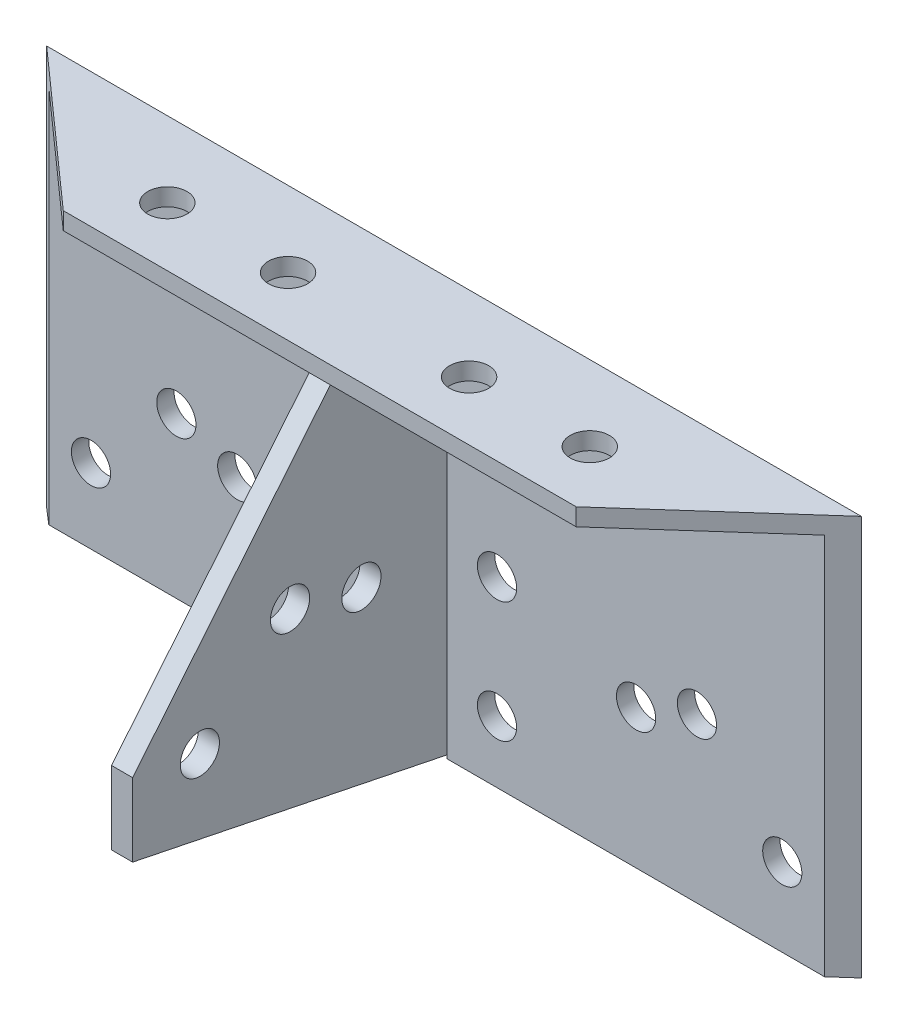
ISO-10303-21;
HEADER;
FILE_DESCRIPTION(('STEP AP214'),'2;1');
FILE_NAME('part.step','',(''),(''),'','','');
FILE_SCHEMA(('AUTOMOTIVE_DESIGN { 1 0 10303 214 1 1 1 1 }'));
ENDSEC;
DATA;
#1=APPLICATION_CONTEXT('core data for automotive mechanical design processes');
#2=APPLICATION_PROTOCOL_DEFINITION('international standard','automotive_design',2000,#1);
#3=PRODUCT_CONTEXT('',#1,'mechanical');
#4=PRODUCT('Part','Part','',(#3));
#5=PRODUCT_RELATED_PRODUCT_CATEGORY('part','',(#4));
#6=PRODUCT_DEFINITION_FORMATION('','',#4);
#7=PRODUCT_DEFINITION_CONTEXT('part definition',#1,'design');
#8=PRODUCT_DEFINITION('design','',#6,#7);
#9=PRODUCT_DEFINITION_SHAPE('','',#8);
#10=(LENGTH_UNIT() NAMED_UNIT(*) SI_UNIT(.MILLI.,.METRE.));
#11=(NAMED_UNIT(*) PLANE_ANGLE_UNIT() SI_UNIT($,.RADIAN.));
#12=(NAMED_UNIT(*) SI_UNIT($,.STERADIAN.) SOLID_ANGLE_UNIT());
#13=UNCERTAINTY_MEASURE_WITH_UNIT(LENGTH_MEASURE(1.E-05),#10,'distance_accuracy_value','');
#14=(GEOMETRIC_REPRESENTATION_CONTEXT(3) GLOBAL_UNCERTAINTY_ASSIGNED_CONTEXT((#13)) GLOBAL_UNIT_ASSIGNED_CONTEXT((#10,
#11,#12)) REPRESENTATION_CONTEXT('',''));
#15=CARTESIAN_POINT('',(0.,0.,0.));
#16=DIRECTION('',(0.,0.,1.));
#17=DIRECTION('',(1.,0.,0.));
#18=AXIS2_PLACEMENT_3D('',#15,#16,#17);
#19=CARTESIAN_POINT('',(0.,265.,11.5));
#20=DIRECTION('',(0.,0.,-1.));
#21=DIRECTION('',(-1.,0.,0.));
#22=AXIS2_PLACEMENT_3D('',#19,#20,#21);
#23=PLANE('',#22);
#24=CARTESIAN_POINT('',(97.4659453904821,108.465945390483,11.5));
#25=DIRECTION('',(0.,0.,1.));
#26=DIRECTION('',(1.,0.,0.));
#27=AXIS2_PLACEMENT_3D('',#24,#25,#26);
#28=CIRCLE('',#27,13.);
#29=CARTESIAN_POINT('',(110.465945390482,108.465945390483,11.5));
#30=VERTEX_POINT('',#29);
#31=EDGE_CURVE('E144',#30,#30,#28,.T.);
#32=ORIENTED_EDGE('',*,*,#31,.F.);
#33=EDGE_LOOP('',(#32));
#34=FACE_BOUND('',#33,.T.);
#35=CARTESIAN_POINT('',(40.8974028955581,51.897402895559,11.5));
#36=DIRECTION('',(0.,0.,1.));
#37=DIRECTION('',(1.,0.,0.));
#38=AXIS2_PLACEMENT_3D('',#35,#36,#37);
#39=CIRCLE('',#38,13.);
#40=CARTESIAN_POINT('',(53.8974028955582,51.897402895559,11.5));
#41=VERTEX_POINT('',#40);
#42=EDGE_CURVE('E297',#41,#41,#39,.T.);
#43=ORIENTED_EDGE('',*,*,#42,.F.);
#44=EDGE_LOOP('',(#43));
#45=FACE_BOUND('',#44,.T.);
#46=CARTESIAN_POINT('',(230.,121.,11.5));
#47=DIRECTION('',(0.,0.,1.));
#48=DIRECTION('',(1.,0.,0.));
#49=AXIS2_PLACEMENT_3D('',#46,#47,#48);
#50=CIRCLE('',#49,13.);
#51=CARTESIAN_POINT('',(243.,121.,11.5));
#52=VERTEX_POINT('',#51);
#53=EDGE_CURVE('E285',#52,#52,#50,.T.);
#54=ORIENTED_EDGE('',*,*,#53,.F.);
#55=EDGE_LOOP('',(#54));
#56=FACE_BOUND('',#55,.T.);
#57=CARTESIAN_POINT('',(230.,41.,11.5));
#58=DIRECTION('',(0.,0.,1.));
#59=DIRECTION('',(1.,0.,0.));
#60=AXIS2_PLACEMENT_3D('',#57,#58,#59);
#61=CIRCLE('',#60,13.);
#62=CARTESIAN_POINT('',(243.,41.,11.5));
#63=VERTEX_POINT('',#62);
#64=EDGE_CURVE('E279',#63,#63,#61,.T.);
#65=ORIENTED_EDGE('',*,*,#64,.F.);
#66=EDGE_LOOP('',(#65));
#67=FACE_BOUND('',#66,.T.);
#68=CARTESIAN_POINT('',(137.829012361263,92.2615340814046,11.5));
#69=DIRECTION('',(0.,0.,1.));
#70=DIRECTION('',(1.,0.,0.));
#71=AXIS2_PLACEMENT_3D('',#68,#69,#70);
#72=CIRCLE('',#71,13.);
#73=CARTESIAN_POINT('',(150.829012361263,92.2615340814046,11.5));
#74=VERTEX_POINT('',#73);
#75=EDGE_CURVE('E261',#74,#74,#72,.T.);
#76=ORIENTED_EDGE('',*,*,#75,.F.);
#77=EDGE_LOOP('',(#76));
#78=FACE_BOUND('',#77,.T.);
#79=DIRECTION('',(0.,-1.,0.));
#80=VECTOR('',#79,1.);
#81=CARTESIAN_POINT('',(12.9213483146067,265.,11.5));
#82=LINE('',#81,#80);
#83=CARTESIAN_POINT('',(12.9213483146067,253.5,11.5));
#84=VERTEX_POINT('',#83);
#85=CARTESIAN_POINT('',(12.9213483146067,2.35227272727279,11.5));
#86=VERTEX_POINT('',#85);
#87=EDGE_CURVE('E235',#84,#86,#82,.T.);
#88=ORIENTED_EDGE('',*,*,#87,.T.);
#89=DIRECTION('',(1.,0.,0.));
#90=VECTOR('',#89,1.);
#91=CARTESIAN_POINT('',(0.,2.35227272727279,11.5));
#92=LINE('',#91,#90);
#93=CARTESIAN_POINT('',(263.,2.35227272727273,11.5));
#94=VERTEX_POINT('',#93);
#95=EDGE_CURVE('E129',#86,#94,#92,.T.);
#96=ORIENTED_EDGE('',*,*,#95,.T.);
#97=DIRECTION('',(0.,-1.,0.));
#98=VECTOR('',#97,1.);
#99=CARTESIAN_POINT('',(263.,253.5,11.5));
#100=LINE('',#99,#98);
#101=CARTESIAN_POINT('',(263.,253.5,11.5));
#102=VERTEX_POINT('',#101);
#103=EDGE_CURVE('E204',#102,#94,#100,.T.);
#104=ORIENTED_EDGE('',*,*,#103,.F.);
#105=DIRECTION('',(1.,0.,0.));
#106=VECTOR('',#105,1.);
#107=CARTESIAN_POINT('',(0.,253.5,11.5));
#108=LINE('',#107,#106);
#109=EDGE_CURVE('E246',#84,#102,#108,.T.);
#110=ORIENTED_EDGE('',*,*,#109,.F.);
#111=EDGE_LOOP('',(#88,#96,#104,#110));
#112=FACE_BOUND('',#111,.T.);
#113=ADVANCED_FACE('F35',(#34,#45,#56,#67,#78,#112),#23,.F.);
#114=CARTESIAN_POINT('',(499.102597104442,51.8974028955591,11.5));
#115=DIRECTION('',(0.,0.,1.));
#116=DIRECTION('',(-1.,0.,0.));
#117=AXIS2_PLACEMENT_3D('',#114,#115,#116);
#118=CIRCLE('',#117,13.0000000000001);
#119=CARTESIAN_POINT('',(486.102597104442,51.8974028955591,11.5));
#120=VERTEX_POINT('',#119);
#121=EDGE_CURVE('E291',#120,#120,#118,.T.);
#122=ORIENTED_EDGE('',*,*,#121,.F.);
#123=EDGE_LOOP('',(#122));
#124=FACE_BOUND('',#123,.T.);
#125=CARTESIAN_POINT('',(310.,41.,11.5));
#126=DIRECTION('',(0.,0.,1.));
#127=DIRECTION('',(-1.,0.,0.));
#128=AXIS2_PLACEMENT_3D('',#125,#126,#127);
#129=CIRCLE('',#128,13.);
#130=CARTESIAN_POINT('',(297.,41.,11.5));
#131=VERTEX_POINT('',#130);
#132=EDGE_CURVE('E273',#131,#131,#129,.T.);
#133=ORIENTED_EDGE('',*,*,#132,.F.);
#134=EDGE_LOOP('',(#133));
#135=FACE_BOUND('',#134,.T.);
#136=CARTESIAN_POINT('',(310.,121.,11.5));
#137=DIRECTION('',(0.,0.,1.));
#138=DIRECTION('',(-1.,0.,0.));
#139=AXIS2_PLACEMENT_3D('',#136,#137,#138);
#140=CIRCLE('',#139,13.);
#141=CARTESIAN_POINT('',(297.,121.,11.5));
#142=VERTEX_POINT('',#141);
#143=EDGE_CURVE('E267',#142,#142,#140,.T.);
#144=ORIENTED_EDGE('',*,*,#143,.F.);
#145=EDGE_LOOP('',(#144));
#146=FACE_BOUND('',#145,.T.);
#147=CARTESIAN_POINT('',(442.534054609518,108.465945390483,11.5));
#148=DIRECTION('',(0.,0.,1.));
#149=DIRECTION('',(-1.,0.,0.));
#150=AXIS2_PLACEMENT_3D('',#147,#148,#149);
#151=CIRCLE('',#150,13.);
#152=CARTESIAN_POINT('',(429.534054609518,108.465945390483,11.5));
#153=VERTEX_POINT('',#152);
#154=EDGE_CURVE('E255',#153,#153,#151,.T.);
#155=ORIENTED_EDGE('',*,*,#154,.F.);
#156=EDGE_LOOP('',(#155));
#157=FACE_BOUND('',#156,.T.);
#158=CARTESIAN_POINT('',(402.170987638737,92.2615340814046,11.5));
#159=DIRECTION('',(0.,0.,1.));
#160=DIRECTION('',(-1.,0.,0.));
#161=AXIS2_PLACEMENT_3D('',#158,#159,#160);
#162=CIRCLE('',#161,13.);
#163=CARTESIAN_POINT('',(389.170987638737,92.2615340814046,11.5));
#164=VERTEX_POINT('',#163);
#165=EDGE_CURVE('E249',#164,#164,#162,.T.);
#166=ORIENTED_EDGE('',*,*,#165,.F.);
#167=EDGE_LOOP('',(#166));
#168=FACE_BOUND('',#167,.T.);
#169=DIRECTION('',(0.,1.,0.));
#170=VECTOR('',#169,1.);
#171=CARTESIAN_POINT('',(277.,253.5,11.5));
#172=LINE('',#171,#170);
#173=CARTESIAN_POINT('',(277.,0.,11.5));
#174=VERTEX_POINT('',#173);
#175=CARTESIAN_POINT('',(277.,2.35227272727274,11.5000000000001));
#176=VERTEX_POINT('',#175);
#177=EDGE_CURVE('E200',#174,#176,#172,.T.);
#178=ORIENTED_EDGE('',*,*,#177,.F.);
#179=DIRECTION('',(1.,0.,0.));
#180=VECTOR('',#179,1.);
#181=CARTESIAN_POINT('',(0.,0.,11.5));
#182=LINE('',#181,#180);
#183=CARTESIAN_POINT('',(527.078651685393,0.,11.5));
#184=VERTEX_POINT('',#183);
#185=EDGE_CURVE('E157',#174,#184,#182,.T.);
#186=ORIENTED_EDGE('',*,*,#185,.T.);
#187=DIRECTION('',(0.,1.,0.));
#188=VECTOR('',#187,1.);
#189=CARTESIAN_POINT('',(527.078651685393,265.,11.5));
#190=LINE('',#189,#188);
#191=CARTESIAN_POINT('',(527.078651685393,253.5,11.5));
#192=VERTEX_POINT('',#191);
#193=EDGE_CURVE('E228',#184,#192,#190,.T.);
#194=ORIENTED_EDGE('',*,*,#193,.T.);
#195=CARTESIAN_POINT('',(277.,253.5,11.5));
#196=VERTEX_POINT('',#195);
#197=EDGE_CURVE('E237',#196,#192,#108,.T.);
#198=ORIENTED_EDGE('',*,*,#197,.F.);
#199=EDGE_CURVE('E207',#176,#196,#172,.T.);
#200=ORIENTED_EDGE('',*,*,#199,.F.);
#201=EDGE_LOOP('',(#178,#186,#194,#198,#200));
#202=FACE_BOUND('',#201,.T.);
#203=ADVANCED_FACE('F310',(#124,#135,#146,#157,#168,#202),#23,.F.);
#204=CARTESIAN_POINT('',(0.,253.5,89.));
#205=DIRECTION('',(0.,1.,0.));
#206=DIRECTION('',(0.,0.,1.));
#207=AXIS2_PLACEMENT_3D('',#204,#205,#206);
#208=PLANE('',#207);
#209=CARTESIAN_POINT('',(210.,253.5,50.));
#210=DIRECTION('',(0.,1.,0.));
#211=DIRECTION('',(0.,0.,1.));
#212=AXIS2_PLACEMENT_3D('',#209,#210,#211);
#213=CIRCLE('',#212,13.);
#214=CARTESIAN_POINT('',(210.,253.5,63.));
#215=VERTEX_POINT('',#214);
#216=EDGE_CURVE('E163',#215,#215,#213,.T.);
#217=ORIENTED_EDGE('',*,*,#216,.T.);
#218=EDGE_LOOP('',(#217));
#219=FACE_BOUND('',#218,.T.);
#220=CARTESIAN_POINT('',(130.,253.5,50.));
#221=DIRECTION('',(0.,1.,0.));
#222=DIRECTION('',(0.,0.,1.));
#223=AXIS2_PLACEMENT_3D('',#220,#221,#222);
#224=CIRCLE('',#223,13.);
#225=CARTESIAN_POINT('',(130.,253.5,63.));
#226=VERTEX_POINT('',#225);
#227=EDGE_CURVE('E175',#226,#226,#224,.T.);
#228=ORIENTED_EDGE('',*,*,#227,.T.);
#229=EDGE_LOOP('',(#228));
#230=FACE_BOUND('',#229,.T.);
#231=DIRECTION('',(0.,0.,-1.));
#232=VECTOR('',#231,1.);
#233=CARTESIAN_POINT('',(263.,253.5,220.));
#234=LINE('',#233,#232);
#235=CARTESIAN_POINT('',(263.,253.5,89.));
#236=VERTEX_POINT('',#235);
#237=EDGE_CURVE('E196',#236,#102,#234,.T.);
#238=ORIENTED_EDGE('',*,*,#237,.F.);
#239=DIRECTION('',(1.,0.,0.));
#240=VECTOR('',#239,1.);
#241=CARTESIAN_POINT('',(0.,253.5,89.));
#242=LINE('',#241,#240);
#243=CARTESIAN_POINT('',(100.,253.5,89.));
#244=VERTEX_POINT('',#243);
#245=EDGE_CURVE('E238',#244,#236,#242,.T.);
#246=ORIENTED_EDGE('',*,*,#245,.F.);
#247=DIRECTION('',(-0.746997038573461,0.,-0.66482736433038));
#248=VECTOR('',#247,1.);
#249=CARTESIAN_POINT('',(44.199542436248,253.5,39.3375927682607));
#250=LINE('',#249,#248);
#251=EDGE_CURVE('E232',#244,#84,#250,.T.);
#252=ORIENTED_EDGE('',*,*,#251,.T.);
#253=ORIENTED_EDGE('',*,*,#109,.T.);
#254=EDGE_LOOP('',(#238,#246,#252,#253));
#255=FACE_BOUND('',#254,.T.);
#256=ADVANCED_FACE('F364',(#219,#230,#255),#208,.F.);
#257=CARTESIAN_POINT('',(330.,253.5,50.));
#258=DIRECTION('',(0.,1.,0.));
#259=DIRECTION('',(0.,0.,1.));
#260=AXIS2_PLACEMENT_3D('',#257,#258,#259);
#261=CIRCLE('',#260,13.);
#262=CARTESIAN_POINT('',(330.,253.5,62.9999999999999));
#263=VERTEX_POINT('',#262);
#264=EDGE_CURVE('E168',#263,#263,#261,.T.);
#265=ORIENTED_EDGE('',*,*,#264,.T.);
#266=EDGE_LOOP('',(#265));
#267=FACE_BOUND('',#266,.T.);
#268=CARTESIAN_POINT('',(410.,253.5,50.));
#269=DIRECTION('',(0.,1.,0.));
#270=DIRECTION('',(0.,0.,1.));
#271=AXIS2_PLACEMENT_3D('',#268,#269,#270);
#272=CIRCLE('',#271,13.);
#273=CARTESIAN_POINT('',(410.,253.5,63.));
#274=VERTEX_POINT('',#273);
#275=EDGE_CURVE('E171',#274,#274,#272,.T.);
#276=ORIENTED_EDGE('',*,*,#275,.T.);
#277=EDGE_LOOP('',(#276));
#278=FACE_BOUND('',#277,.T.);
#279=DIRECTION('',(0.,0.,-1.));
#280=VECTOR('',#279,1.);
#281=CARTESIAN_POINT('',(277.,253.5,220.));
#282=LINE('',#281,#280);
#283=CARTESIAN_POINT('',(277.,253.5,89.));
#284=VERTEX_POINT('',#283);
#285=EDGE_CURVE('E190',#284,#196,#282,.T.);
#286=ORIENTED_EDGE('',*,*,#285,.T.);
#287=ORIENTED_EDGE('',*,*,#197,.T.);
#288=DIRECTION('',(-0.746997038573461,0.,0.66482736433038));
#289=VECTOR('',#288,1.);
#290=CARTESIAN_POINT('',(194.477986719491,253.5,307.514591819653));
#291=LINE('',#290,#289);
#292=CARTESIAN_POINT('',(440.,253.5,89.));
#293=VERTEX_POINT('',#292);
#294=EDGE_CURVE('E224',#192,#293,#291,.T.);
#295=ORIENTED_EDGE('',*,*,#294,.T.);
#296=EDGE_CURVE('E243',#284,#293,#242,.T.);
#297=ORIENTED_EDGE('',*,*,#296,.F.);
#298=EDGE_LOOP('',(#286,#287,#295,#297));
#299=FACE_BOUND('',#298,.T.);
#300=ADVANCED_FACE('F373',(#267,#278,#299),#208,.F.);
#301=CARTESIAN_POINT('',(0.,265.,0.));
#302=DIRECTION('',(0.,0.,-1.));
#303=DIRECTION('',(-1.,0.,0.));
#304=AXIS2_PLACEMENT_3D('',#301,#302,#303);
#305=PLANE('',#304);
#306=CARTESIAN_POINT('',(442.534054609518,108.465945390483,0.));
#307=DIRECTION('',(0.,0.,1.));
#308=DIRECTION('',(-1.,0.,0.));
#309=AXIS2_PLACEMENT_3D('',#306,#307,#308);
#310=CIRCLE('',#309,13.);
#311=CARTESIAN_POINT('',(429.534054609518,108.465945390483,0.));
#312=VERTEX_POINT('',#311);
#313=EDGE_CURVE('E252',#312,#312,#310,.T.);
#314=ORIENTED_EDGE('',*,*,#313,.T.);
#315=EDGE_LOOP('',(#314));
#316=FACE_BOUND('',#315,.T.);
#317=CARTESIAN_POINT('',(310.,121.,0.));
#318=DIRECTION('',(0.,0.,1.));
#319=DIRECTION('',(-1.,0.,0.));
#320=AXIS2_PLACEMENT_3D('',#317,#318,#319);
#321=CIRCLE('',#320,13.);
#322=CARTESIAN_POINT('',(297.,121.,0.));
#323=VERTEX_POINT('',#322);
#324=EDGE_CURVE('E264',#323,#323,#321,.T.);
#325=ORIENTED_EDGE('',*,*,#324,.T.);
#326=EDGE_LOOP('',(#325));
#327=FACE_BOUND('',#326,.T.);
#328=CARTESIAN_POINT('',(230.,41.,0.));
#329=DIRECTION('',(0.,0.,1.));
#330=DIRECTION('',(1.,0.,0.));
#331=AXIS2_PLACEMENT_3D('',#328,#329,#330);
#332=CIRCLE('',#331,13.);
#333=CARTESIAN_POINT('',(243.,41.,0.));
#334=VERTEX_POINT('',#333);
#335=EDGE_CURVE('E276',#334,#334,#332,.T.);
#336=ORIENTED_EDGE('',*,*,#335,.T.);
#337=EDGE_LOOP('',(#336));
#338=FACE_BOUND('',#337,.T.);
#339=CARTESIAN_POINT('',(499.102597104442,51.8974028955591,0.));
#340=DIRECTION('',(0.,0.,1.));
#341=DIRECTION('',(-1.,0.,0.));
#342=AXIS2_PLACEMENT_3D('',#339,#340,#341);
#343=CIRCLE('',#342,13.0000000000001);
#344=CARTESIAN_POINT('',(486.102597104442,51.8974028955591,0.));
#345=VERTEX_POINT('',#344);
#346=EDGE_CURVE('E288',#345,#345,#343,.T.);
#347=ORIENTED_EDGE('',*,*,#346,.T.);
#348=EDGE_LOOP('',(#347));
#349=FACE_BOUND('',#348,.T.);
#350=CARTESIAN_POINT('',(97.4659453904821,108.465945390483,0.));
#351=DIRECTION('',(0.,0.,1.));
#352=DIRECTION('',(1.,0.,0.));
#353=AXIS2_PLACEMENT_3D('',#350,#351,#352);
#354=CIRCLE('',#353,13.);
#355=CARTESIAN_POINT('',(110.465945390482,108.465945390483,0.));
#356=VERTEX_POINT('',#355);
#357=EDGE_CURVE('E300',#356,#356,#354,.T.);
#358=ORIENTED_EDGE('',*,*,#357,.T.);
#359=EDGE_LOOP('',(#358));
#360=FACE_BOUND('',#359,.T.);
#361=DIRECTION('',(0.,-1.,0.));
#362=VECTOR('',#361,1.);
#363=CARTESIAN_POINT('',(0.,0.,0.));
#364=LINE('',#363,#362);
#365=CARTESIAN_POINT('',(0.,265.,0.));
#366=VERTEX_POINT('',#365);
#367=CARTESIAN_POINT('',(0.,0.,0.));
#368=VERTEX_POINT('',#367);
#369=EDGE_CURVE('E135',#366,#368,#364,.T.);
#370=ORIENTED_EDGE('',*,*,#369,.F.);
#371=DIRECTION('',(-1.,0.,0.));
#372=VECTOR('',#371,1.);
#373=CARTESIAN_POINT('',(0.,265.,0.));
#374=LINE('',#373,#372);
#375=CARTESIAN_POINT('',(540.,265.,0.));
#376=VERTEX_POINT('',#375);
#377=EDGE_CURVE('E152',#376,#366,#374,.T.);
#378=ORIENTED_EDGE('',*,*,#377,.F.);
#379=DIRECTION('',(0.,1.,0.));
#380=VECTOR('',#379,1.);
#381=CARTESIAN_POINT('',(540.,0.,0.));
#382=LINE('',#381,#380);
#383=CARTESIAN_POINT('',(540.,0.,0.));
#384=VERTEX_POINT('',#383);
#385=EDGE_CURVE('E150',#384,#376,#382,.T.);
#386=ORIENTED_EDGE('',*,*,#385,.F.);
#387=DIRECTION('',(1.,0.,0.));
#388=VECTOR('',#387,1.);
#389=CARTESIAN_POINT('',(0.,0.,0.));
#390=LINE('',#389,#388);
#391=CARTESIAN_POINT('',(277.,0.,0.));
#392=VERTEX_POINT('',#391);
#393=EDGE_CURVE('E143',#392,#384,#390,.T.);
#394=ORIENTED_EDGE('',*,*,#393,.F.);
#395=EDGE_CURVE('E126',#368,#392,#390,.T.);
#396=ORIENTED_EDGE('',*,*,#395,.F.);
#397=EDGE_LOOP('',(#370,#378,#386,#394,#396));
#398=FACE_BOUND('',#397,.T.);
#399=CARTESIAN_POINT('',(40.8974028955581,51.897402895559,0.));
#400=DIRECTION('',(0.,0.,1.));
#401=DIRECTION('',(1.,0.,0.));
#402=AXIS2_PLACEMENT_3D('',#399,#400,#401);
#403=CIRCLE('',#402,13.);
#404=CARTESIAN_POINT('',(53.8974028955582,51.897402895559,0.));
#405=VERTEX_POINT('',#404);
#406=EDGE_CURVE('E294',#405,#405,#403,.T.);
#407=ORIENTED_EDGE('',*,*,#406,.T.);
#408=EDGE_LOOP('',(#407));
#409=FACE_BOUND('',#408,.T.);
#410=CARTESIAN_POINT('',(230.,121.,0.));
#411=DIRECTION('',(0.,0.,1.));
#412=DIRECTION('',(1.,0.,0.));
#413=AXIS2_PLACEMENT_3D('',#410,#411,#412);
#414=CIRCLE('',#413,13.);
#415=CARTESIAN_POINT('',(243.,121.,0.));
#416=VERTEX_POINT('',#415);
#417=EDGE_CURVE('E282',#416,#416,#414,.T.);
#418=ORIENTED_EDGE('',*,*,#417,.T.);
#419=EDGE_LOOP('',(#418));
#420=FACE_BOUND('',#419,.T.);
#421=CARTESIAN_POINT('',(310.,41.,0.));
#422=DIRECTION('',(0.,0.,1.));
#423=DIRECTION('',(-1.,0.,0.));
#424=AXIS2_PLACEMENT_3D('',#421,#422,#423);
#425=CIRCLE('',#424,13.);
#426=CARTESIAN_POINT('',(297.,41.,0.));
#427=VERTEX_POINT('',#426);
#428=EDGE_CURVE('E270',#427,#427,#425,.T.);
#429=ORIENTED_EDGE('',*,*,#428,.T.);
#430=EDGE_LOOP('',(#429));
#431=FACE_BOUND('',#430,.T.);
#432=CARTESIAN_POINT('',(137.829012361263,92.2615340814046,0.));
#433=DIRECTION('',(0.,0.,1.));
#434=DIRECTION('',(1.,0.,0.));
#435=AXIS2_PLACEMENT_3D('',#432,#433,#434);
#436=CIRCLE('',#435,13.);
#437=CARTESIAN_POINT('',(150.829012361263,92.2615340814046,0.));
#438=VERTEX_POINT('',#437);
#439=EDGE_CURVE('E258',#438,#438,#436,.T.);
#440=ORIENTED_EDGE('',*,*,#439,.T.);
#441=EDGE_LOOP('',(#440));
#442=FACE_BOUND('',#441,.T.);
#443=CARTESIAN_POINT('',(402.170987638737,92.2615340814046,0.));
#444=DIRECTION('',(0.,0.,1.));
#445=DIRECTION('',(-1.,0.,0.));
#446=AXIS2_PLACEMENT_3D('',#443,#444,#445);
#447=CIRCLE('',#446,13.);
#448=CARTESIAN_POINT('',(389.170987638737,92.2615340814046,0.));
#449=VERTEX_POINT('',#448);
#450=EDGE_CURVE('E245',#449,#449,#447,.T.);
#451=ORIENTED_EDGE('',*,*,#450,.T.);
#452=EDGE_LOOP('',(#451));
#453=FACE_BOUND('',#452,.T.);
#454=ADVANCED_FACE('F147',(#316,#327,#338,#349,#360,#398,#409,#420,#431,#442,#453),#305,.T.);
#455=CARTESIAN_POINT('',(0.,0.,11.5));
#456=DIRECTION('',(0.,1.,0.));
#457=DIRECTION('',(0.,0.,1.));
#458=AXIS2_PLACEMENT_3D('',#455,#456,#457);
#459=PLANE('',#458);
#460=ORIENTED_EDGE('',*,*,#185,.F.);
#461=DIRECTION('',(0.,0.,-1.));
#462=VECTOR('',#461,1.);
#463=CARTESIAN_POINT('',(277.,0.,0.));
#464=LINE('',#463,#462);
#465=EDGE_CURVE('E319',#174,#392,#464,.T.);
#466=ORIENTED_EDGE('',*,*,#465,.T.);
#467=ORIENTED_EDGE('',*,*,#393,.T.);
#468=DIRECTION('',(-0.746997038573461,0.,0.66482736433038));
#469=VECTOR('',#468,1.);
#470=CARTESIAN_POINT('',(540.,0.,0.));
#471=LINE('',#470,#469);
#472=EDGE_CURVE('E221',#384,#184,#471,.T.);
#473=ORIENTED_EDGE('',*,*,#472,.T.);
#474=EDGE_LOOP('',(#460,#466,#467,#473));
#475=FACE_BOUND('',#474,.T.);
#476=ADVANCED_FACE('F37',(#475),#459,.F.);
#477=CARTESIAN_POINT('',(0.,265.,11.5));
#478=DIRECTION('',(0.,-1.,0.));
#479=DIRECTION('',(0.,0.,-1.));
#480=AXIS2_PLACEMENT_3D('',#477,#478,#479);
#481=PLANE('',#480);
#482=CARTESIAN_POINT('',(130.,265.,50.));
#483=DIRECTION('',(0.,1.,0.));
#484=DIRECTION('',(0.,0.,1.));
#485=AXIS2_PLACEMENT_3D('',#482,#483,#484);
#486=CIRCLE('',#485,13.);
#487=CARTESIAN_POINT('',(130.,265.,63.));
#488=VERTEX_POINT('',#487);
#489=EDGE_CURVE('E172',#488,#488,#486,.T.);
#490=ORIENTED_EDGE('',*,*,#489,.F.);
#491=EDGE_LOOP('',(#490));
#492=FACE_BOUND('',#491,.T.);
#493=CARTESIAN_POINT('',(410.,265.,50.));
#494=DIRECTION('',(0.,1.,0.));
#495=DIRECTION('',(0.,0.,-1.));
#496=AXIS2_PLACEMENT_3D('',#493,#494,#495);
#497=CIRCLE('',#496,13.);
#498=CARTESIAN_POINT('',(410.,265.,37.));
#499=VERTEX_POINT('',#498);
#500=EDGE_CURVE('E214',#499,#499,#497,.T.);
#501=ORIENTED_EDGE('',*,*,#500,.F.);
#502=EDGE_LOOP('',(#501));
#503=FACE_BOUND('',#502,.T.);
#504=CARTESIAN_POINT('',(330.,265.,50.));
#505=DIRECTION('',(0.,1.,0.));
#506=DIRECTION('',(0.,0.,-1.));
#507=AXIS2_PLACEMENT_3D('',#504,#505,#506);
#508=CIRCLE('',#507,13.);
#509=CARTESIAN_POINT('',(330.,265.,37.));
#510=VERTEX_POINT('',#509);
#511=EDGE_CURVE('E211',#510,#510,#508,.T.);
#512=ORIENTED_EDGE('',*,*,#511,.F.);
#513=EDGE_LOOP('',(#512));
#514=FACE_BOUND('',#513,.T.);
#515=CARTESIAN_POINT('',(210.,265.,50.));
#516=DIRECTION('',(0.,1.,0.));
#517=DIRECTION('',(0.,0.,1.));
#518=AXIS2_PLACEMENT_3D('',#515,#516,#517);
#519=CIRCLE('',#518,13.);
#520=CARTESIAN_POINT('',(210.,265.,63.));
#521=VERTEX_POINT('',#520);
#522=EDGE_CURVE('E167',#521,#521,#519,.T.);
#523=ORIENTED_EDGE('',*,*,#522,.F.);
#524=EDGE_LOOP('',(#523));
#525=FACE_BOUND('',#524,.T.);
#526=DIRECTION('',(-1.,0.,0.));
#527=VECTOR('',#526,1.);
#528=CARTESIAN_POINT('',(0.,265.,89.));
#529=LINE('',#528,#527);
#530=CARTESIAN_POINT('',(440.,265.,89.));
#531=VERTEX_POINT('',#530);
#532=CARTESIAN_POINT('',(100.,265.,89.));
#533=VERTEX_POINT('',#532);
#534=EDGE_CURVE('E241',#531,#533,#529,.T.);
#535=ORIENTED_EDGE('',*,*,#534,.F.);
#536=DIRECTION('',(-0.746997038573461,0.,0.66482736433038));
#537=VECTOR('',#536,1.);
#538=CARTESIAN_POINT('',(540.,265.,0.));
#539=LINE('',#538,#537);
#540=EDGE_CURVE('E166',#376,#531,#539,.T.);
#541=ORIENTED_EDGE('',*,*,#540,.F.);
#542=ORIENTED_EDGE('',*,*,#377,.T.);
#543=DIRECTION('',(-0.746997038573461,0.,-0.66482736433038));
#544=VECTOR('',#543,1.);
#545=CARTESIAN_POINT('',(0.,265.,0.));
#546=LINE('',#545,#544);
#547=EDGE_CURVE('E139',#533,#366,#546,.T.);
#548=ORIENTED_EDGE('',*,*,#547,.F.);
#549=EDGE_LOOP('',(#535,#541,#542,#548));
#550=FACE_BOUND('',#549,.T.);
#551=ADVANCED_FACE('F375',(#492,#503,#514,#525,#550),#481,.F.);
#552=CARTESIAN_POINT('',(97.4659453904821,108.465945390483,11.5));
#553=DIRECTION('',(0.,0.,-1.));
#554=DIRECTION('',(-1.,0.,0.));
#555=AXIS2_PLACEMENT_3D('',#552,#553,#554);
#556=CYLINDRICAL_SURFACE('',#555,13.);
#557=ORIENTED_EDGE('',*,*,#31,.T.);
#558=EDGE_LOOP('',(#557));
#559=FACE_BOUND('',#558,.T.);
#560=ORIENTED_EDGE('',*,*,#357,.F.);
#561=EDGE_LOOP('',(#560));
#562=FACE_BOUND('',#561,.T.);
#563=ADVANCED_FACE('F370',(#559,#562),#556,.F.);
#564=CARTESIAN_POINT('',(40.8974028955581,51.897402895559,11.5));
#565=DIRECTION('',(0.,0.,-1.));
#566=DIRECTION('',(-1.,0.,0.));
#567=AXIS2_PLACEMENT_3D('',#564,#565,#566);
#568=CYLINDRICAL_SURFACE('',#567,13.);
#569=ORIENTED_EDGE('',*,*,#42,.T.);
#570=EDGE_LOOP('',(#569));
#571=FACE_BOUND('',#570,.T.);
#572=ORIENTED_EDGE('',*,*,#406,.F.);
#573=EDGE_LOOP('',(#572));
#574=FACE_BOUND('',#573,.T.);
#575=ADVANCED_FACE('F382',(#571,#574),#568,.F.);
#576=CARTESIAN_POINT('',(499.102597104442,51.8974028955591,11.5));
#577=DIRECTION('',(0.,0.,-1.));
#578=DIRECTION('',(-1.,0.,0.));
#579=AXIS2_PLACEMENT_3D('',#576,#577,#578);
#580=CYLINDRICAL_SURFACE('',#579,13.0000000000001);
#581=ORIENTED_EDGE('',*,*,#121,.T.);
#582=EDGE_LOOP('',(#581));
#583=FACE_BOUND('',#582,.T.);
#584=ORIENTED_EDGE('',*,*,#346,.F.);
#585=EDGE_LOOP('',(#584));
#586=FACE_BOUND('',#585,.T.);
#587=ADVANCED_FACE('F444',(#583,#586),#580,.F.);
#588=CARTESIAN_POINT('',(230.,121.,11.5));
#589=DIRECTION('',(0.,0.,-1.));
#590=DIRECTION('',(-1.,0.,0.));
#591=AXIS2_PLACEMENT_3D('',#588,#589,#590);
#592=CYLINDRICAL_SURFACE('',#591,13.);
#593=ORIENTED_EDGE('',*,*,#53,.T.);
#594=EDGE_LOOP('',(#593));
#595=FACE_BOUND('',#594,.T.);
#596=ORIENTED_EDGE('',*,*,#417,.F.);
#597=EDGE_LOOP('',(#596));
#598=FACE_BOUND('',#597,.T.);
#599=ADVANCED_FACE('F440',(#595,#598),#592,.F.);
#600=CARTESIAN_POINT('',(230.,41.,11.5));
#601=DIRECTION('',(0.,0.,-1.));
#602=DIRECTION('',(-1.,0.,0.));
#603=AXIS2_PLACEMENT_3D('',#600,#601,#602);
#604=CYLINDRICAL_SURFACE('',#603,13.);
#605=ORIENTED_EDGE('',*,*,#64,.T.);
#606=EDGE_LOOP('',(#605));
#607=FACE_BOUND('',#606,.T.);
#608=ORIENTED_EDGE('',*,*,#335,.F.);
#609=EDGE_LOOP('',(#608));
#610=FACE_BOUND('',#609,.T.);
#611=ADVANCED_FACE('F436',(#607,#610),#604,.F.);
#612=CARTESIAN_POINT('',(310.,41.,11.5));
#613=DIRECTION('',(0.,0.,-1.));
#614=DIRECTION('',(-1.,0.,0.));
#615=AXIS2_PLACEMENT_3D('',#612,#613,#614);
#616=CYLINDRICAL_SURFACE('',#615,13.);
#617=ORIENTED_EDGE('',*,*,#132,.T.);
#618=EDGE_LOOP('',(#617));
#619=FACE_BOUND('',#618,.T.);
#620=ORIENTED_EDGE('',*,*,#428,.F.);
#621=EDGE_LOOP('',(#620));
#622=FACE_BOUND('',#621,.T.);
#623=ADVANCED_FACE('F432',(#619,#622),#616,.F.);
#624=CARTESIAN_POINT('',(310.,121.,11.5));
#625=DIRECTION('',(0.,0.,-1.));
#626=DIRECTION('',(-1.,0.,0.));
#627=AXIS2_PLACEMENT_3D('',#624,#625,#626);
#628=CYLINDRICAL_SURFACE('',#627,13.);
#629=ORIENTED_EDGE('',*,*,#143,.T.);
#630=EDGE_LOOP('',(#629));
#631=FACE_BOUND('',#630,.T.);
#632=ORIENTED_EDGE('',*,*,#324,.F.);
#633=EDGE_LOOP('',(#632));
#634=FACE_BOUND('',#633,.T.);
#635=ADVANCED_FACE('F428',(#631,#634),#628,.F.);
#636=CARTESIAN_POINT('',(137.829012361263,92.2615340814046,11.5));
#637=DIRECTION('',(0.,0.,-1.));
#638=DIRECTION('',(-1.,0.,0.));
#639=AXIS2_PLACEMENT_3D('',#636,#637,#638);
#640=CYLINDRICAL_SURFACE('',#639,13.);
#641=ORIENTED_EDGE('',*,*,#75,.T.);
#642=EDGE_LOOP('',(#641));
#643=FACE_BOUND('',#642,.T.);
#644=ORIENTED_EDGE('',*,*,#439,.F.);
#645=EDGE_LOOP('',(#644));
#646=FACE_BOUND('',#645,.T.);
#647=ADVANCED_FACE('F424',(#643,#646),#640,.F.);
#648=CARTESIAN_POINT('',(442.534054609518,108.465945390483,11.5));
#649=DIRECTION('',(0.,0.,-1.));
#650=DIRECTION('',(-1.,0.,0.));
#651=AXIS2_PLACEMENT_3D('',#648,#649,#650);
#652=CYLINDRICAL_SURFACE('',#651,13.);
#653=ORIENTED_EDGE('',*,*,#154,.T.);
#654=EDGE_LOOP('',(#653));
#655=FACE_BOUND('',#654,.T.);
#656=ORIENTED_EDGE('',*,*,#313,.F.);
#657=EDGE_LOOP('',(#656));
#658=FACE_BOUND('',#657,.T.);
#659=ADVANCED_FACE('F420',(#655,#658),#652,.F.);
#660=CARTESIAN_POINT('',(402.170987638737,92.2615340814046,11.5));
#661=DIRECTION('',(0.,0.,-1.));
#662=DIRECTION('',(-1.,0.,0.));
#663=AXIS2_PLACEMENT_3D('',#660,#661,#662);
#664=CYLINDRICAL_SURFACE('',#663,13.);
#665=ORIENTED_EDGE('',*,*,#165,.T.);
#666=EDGE_LOOP('',(#665));
#667=FACE_BOUND('',#666,.T.);
#668=ORIENTED_EDGE('',*,*,#450,.F.);
#669=EDGE_LOOP('',(#668));
#670=FACE_BOUND('',#669,.T.);
#671=ADVANCED_FACE('F417',(#667,#670),#664,.F.);
#672=CARTESIAN_POINT('',(0.,253.5,89.));
#673=DIRECTION('',(0.,0.,1.));
#674=DIRECTION('',(1.,0.,0.));
#675=AXIS2_PLACEMENT_3D('',#672,#673,#674);
#676=PLANE('',#675);
#677=DIRECTION('',(0.,-1.,0.));
#678=VECTOR('',#677,1.);
#679=CARTESIAN_POINT('',(440.,253.5,89.));
#680=LINE('',#679,#678);
#681=EDGE_CURVE('E160',#531,#293,#680,.T.);
#682=ORIENTED_EDGE('',*,*,#681,.F.);
#683=ORIENTED_EDGE('',*,*,#534,.T.);
#684=DIRECTION('',(0.,1.,0.));
#685=VECTOR('',#684,1.);
#686=CARTESIAN_POINT('',(100.,253.5,89.));
#687=LINE('',#686,#685);
#688=EDGE_CURVE('E158',#244,#533,#687,.T.);
#689=ORIENTED_EDGE('',*,*,#688,.F.);
#690=ORIENTED_EDGE('',*,*,#245,.T.);
#691=EDGE_CURVE('E242',#236,#284,#242,.T.);
#692=ORIENTED_EDGE('',*,*,#691,.T.);
#693=ORIENTED_EDGE('',*,*,#296,.T.);
#694=EDGE_LOOP('',(#682,#683,#689,#690,#692,#693));
#695=FACE_BOUND('',#694,.T.);
#696=ADVANCED_FACE('F397',(#695),#676,.T.);
#697=CARTESIAN_POINT('',(0.,0.,0.));
#698=DIRECTION('',(0.66482736433038,0.,-0.746997038573461));
#699=DIRECTION('',(-0.746997038573461,0.,-0.66482736433038));
#700=AXIS2_PLACEMENT_3D('',#697,#698,#699);
#701=PLANE('',#700);
#702=ORIENTED_EDGE('',*,*,#369,.T.);
#703=DIRECTION('',(0.740184431111828,0.134747211209222,0.658764143689527));
#704=VECTOR('',#703,1.);
#705=CARTESIAN_POINT('',(0.,0.,0.));
#706=LINE('',#705,#704);
#707=EDGE_CURVE('E122',#368,#86,#706,.T.);
#708=ORIENTED_EDGE('',*,*,#707,.T.);
#709=ORIENTED_EDGE('',*,*,#87,.F.);
#710=ORIENTED_EDGE('',*,*,#251,.F.);
#711=ORIENTED_EDGE('',*,*,#688,.T.);
#712=ORIENTED_EDGE('',*,*,#547,.T.);
#713=EDGE_LOOP('',(#702,#708,#709,#710,#711,#712));
#714=FACE_BOUND('',#713,.T.);
#715=ADVANCED_FACE('F136',(#714),#701,.F.);
#716=CARTESIAN_POINT('',(540.,0.,0.));
#717=DIRECTION('',(-0.66482736433038,0.,-0.746997038573461));
#718=DIRECTION('',(-0.746997038573461,0.,0.66482736433038));
#719=AXIS2_PLACEMENT_3D('',#716,#717,#718);
#720=PLANE('',#719);
#721=ORIENTED_EDGE('',*,*,#472,.F.);
#722=ORIENTED_EDGE('',*,*,#385,.T.);
#723=ORIENTED_EDGE('',*,*,#540,.T.);
#724=ORIENTED_EDGE('',*,*,#681,.T.);
#725=ORIENTED_EDGE('',*,*,#294,.F.);
#726=ORIENTED_EDGE('',*,*,#193,.F.);
#727=EDGE_LOOP('',(#721,#722,#723,#724,#725,#726));
#728=FACE_BOUND('',#727,.T.);
#729=ADVANCED_FACE('F318',(#728),#720,.F.);
#730=CARTESIAN_POINT('',(210.,0.,50.));
#731=DIRECTION('',(0.,1.,0.));
#732=DIRECTION('',(0.,0.,1.));
#733=AXIS2_PLACEMENT_3D('',#730,#731,#732);
#734=CYLINDRICAL_SURFACE('',#733,13.);
#735=ORIENTED_EDGE('',*,*,#522,.T.);
#736=EDGE_LOOP('',(#735));
#737=FACE_BOUND('',#736,.T.);
#738=ORIENTED_EDGE('',*,*,#216,.F.);
#739=EDGE_LOOP('',(#738));
#740=FACE_BOUND('',#739,.T.);
#741=ADVANCED_FACE('F534',(#737,#740),#734,.F.);
#742=CARTESIAN_POINT('',(330.,0.,50.));
#743=DIRECTION('',(0.,1.,0.));
#744=DIRECTION('',(0.,0.,1.));
#745=AXIS2_PLACEMENT_3D('',#742,#743,#744);
#746=CYLINDRICAL_SURFACE('',#745,13.);
#747=ORIENTED_EDGE('',*,*,#511,.T.);
#748=EDGE_LOOP('',(#747));
#749=FACE_BOUND('',#748,.T.);
#750=ORIENTED_EDGE('',*,*,#264,.F.);
#751=EDGE_LOOP('',(#750));
#752=FACE_BOUND('',#751,.T.);
#753=ADVANCED_FACE('F541',(#749,#752),#746,.F.);
#754=CARTESIAN_POINT('',(410.,0.,50.));
#755=DIRECTION('',(0.,1.,0.));
#756=DIRECTION('',(0.,0.,1.));
#757=AXIS2_PLACEMENT_3D('',#754,#755,#756);
#758=CYLINDRICAL_SURFACE('',#757,13.);
#759=ORIENTED_EDGE('',*,*,#500,.T.);
#760=EDGE_LOOP('',(#759));
#761=FACE_BOUND('',#760,.T.);
#762=ORIENTED_EDGE('',*,*,#275,.F.);
#763=EDGE_LOOP('',(#762));
#764=FACE_BOUND('',#763,.T.);
#765=ADVANCED_FACE('F549',(#761,#764),#758,.F.);
#766=CARTESIAN_POINT('',(130.,0.,50.));
#767=DIRECTION('',(0.,1.,0.));
#768=DIRECTION('',(0.,0.,1.));
#769=AXIS2_PLACEMENT_3D('',#766,#767,#768);
#770=CYLINDRICAL_SURFACE('',#769,13.);
#771=ORIENTED_EDGE('',*,*,#489,.T.);
#772=EDGE_LOOP('',(#771));
#773=FACE_BOUND('',#772,.T.);
#774=ORIENTED_EDGE('',*,*,#227,.F.);
#775=EDGE_LOOP('',(#774));
#776=FACE_BOUND('',#775,.T.);
#777=ADVANCED_FACE('F557',(#773,#776),#770,.F.);
#778=CARTESIAN_POINT('',(263.,253.5,220.));
#779=DIRECTION('',(1.,0.,0.));
#780=DIRECTION('',(0.,1.,0.));
#781=AXIS2_PLACEMENT_3D('',#778,#779,#780);
#782=PLANE('',#781);
#783=CARTESIAN_POINT('',(263.,126.911974174471,68.3772941125762));
#784=DIRECTION('',(1.,0.,0.));
#785=DIRECTION('',(0.,1.,0.));
#786=AXIS2_PLACEMENT_3D('',#783,#784,#785);
#787=CIRCLE('',#786,13.);
#788=CARTESIAN_POINT('',(263.,139.911974174471,68.3772941125762));
#789=VERTEX_POINT('',#788);
#790=EDGE_CURVE('E336',#789,#789,#787,.T.);
#791=ORIENTED_EDGE('',*,*,#790,.T.);
#792=EDGE_LOOP('',(#791));
#793=FACE_BOUND('',#792,.T.);
#794=CARTESIAN_POINT('',(263.,84.9866525092177,175.46262178759));
#795=DIRECTION('',(1.,0.,0.));
#796=DIRECTION('',(0.,1.,0.));
#797=AXIS2_PLACEMENT_3D('',#794,#795,#796);
#798=CIRCLE('',#797,13.);
#799=CARTESIAN_POINT('',(263.,97.9866525092177,175.46262178759));
#800=VERTEX_POINT('',#799);
#801=EDGE_CURVE('E132',#800,#800,#798,.T.);
#802=ORIENTED_EDGE('',*,*,#801,.T.);
#803=EDGE_LOOP('',(#802));
#804=FACE_BOUND('',#803,.T.);
#805=CARTESIAN_POINT('',(263.,138.142814540616,115.676148082481));
#806=DIRECTION('',(1.,0.,0.));
#807=DIRECTION('',(0.,1.,0.));
#808=AXIS2_PLACEMENT_3D('',#805,#806,#807);
#809=CIRCLE('',#808,13.);
#810=CARTESIAN_POINT('',(263.,151.142814540616,115.676148082481));
#811=VERTEX_POINT('',#810);
#812=EDGE_CURVE('E208',#811,#811,#809,.T.);
#813=ORIENTED_EDGE('',*,*,#812,.T.);
#814=EDGE_LOOP('',(#813));
#815=FACE_BOUND('',#814,.T.);
#816=ORIENTED_EDGE('',*,*,#103,.T.);
#817=DIRECTION('',(0.,0.200396236148707,0.979714932282566));
#818=VECTOR('',#817,1.);
#819=CARTESIAN_POINT('',(263.,53.3730788299455,260.935052057511));
#820=LINE('',#819,#818);
#821=CARTESIAN_POINT('',(263.,45.,220.));
#822=VERTEX_POINT('',#821);
#823=EDGE_CURVE('E330',#94,#822,#820,.T.);
#824=ORIENTED_EDGE('',*,*,#823,.T.);
#825=DIRECTION('',(0.,-1.,0.));
#826=VECTOR('',#825,1.);
#827=CARTESIAN_POINT('',(263.,253.5,220.));
#828=LINE('',#827,#826);
#829=CARTESIAN_POINT('',(263.,93.5,220.));
#830=VERTEX_POINT('',#829);
#831=EDGE_CURVE('E197',#830,#822,#828,.T.);
#832=ORIENTED_EDGE('',*,*,#831,.F.);
#833=DIRECTION('',(0.,0.773741794125483,-0.633501093940239));
#834=VECTOR('',#833,1.);
#835=CARTESIAN_POINT('',(263.,189.288218236243,141.573396319076));
#836=LINE('',#835,#834);
#837=EDGE_CURVE('E57',#830,#236,#836,.T.);
#838=ORIENTED_EDGE('',*,*,#837,.T.);
#839=ORIENTED_EDGE('',*,*,#237,.T.);
#840=EDGE_LOOP('',(#816,#824,#832,#838,#839));
#841=FACE_BOUND('',#840,.T.);
#842=ADVANCED_FACE('F344',(#793,#804,#815,#841),#782,.F.);
#843=CARTESIAN_POINT('',(277.,253.5,220.));
#844=DIRECTION('',(-1.,0.,0.));
#845=DIRECTION('',(0.,0.,1.));
#846=AXIS2_PLACEMENT_3D('',#843,#844,#845);
#847=PLANE('',#846);
#848=CARTESIAN_POINT('',(277.,126.911974174471,68.3772941125762));
#849=DIRECTION('',(1.,0.,0.));
#850=DIRECTION('',(0.,0.,-1.));
#851=AXIS2_PLACEMENT_3D('',#848,#849,#850);
#852=CIRCLE('',#851,13.);
#853=CARTESIAN_POINT('',(277.,126.911974174471,55.3772941125761));
#854=VERTEX_POINT('',#853);
#855=EDGE_CURVE('E321',#854,#854,#852,.T.);
#856=ORIENTED_EDGE('',*,*,#855,.F.);
#857=EDGE_LOOP('',(#856));
#858=FACE_BOUND('',#857,.T.);
#859=CARTESIAN_POINT('',(277.,84.9866525092177,175.46262178759));
#860=DIRECTION('',(1.,0.,0.));
#861=DIRECTION('',(0.,0.,-1.));
#862=AXIS2_PLACEMENT_3D('',#859,#860,#861);
#863=CIRCLE('',#862,13.);
#864=CARTESIAN_POINT('',(277.,84.9866525092177,162.46262178759));
#865=VERTEX_POINT('',#864);
#866=EDGE_CURVE('E192',#865,#865,#863,.T.);
#867=ORIENTED_EDGE('',*,*,#866,.F.);
#868=EDGE_LOOP('',(#867));
#869=FACE_BOUND('',#868,.T.);
#870=CARTESIAN_POINT('',(277.,138.142814540616,115.676148082481));
#871=DIRECTION('',(1.,0.,0.));
#872=DIRECTION('',(0.,0.,-1.));
#873=AXIS2_PLACEMENT_3D('',#870,#871,#872);
#874=CIRCLE('',#873,13.);
#875=CARTESIAN_POINT('',(277.,138.142814540616,102.676148082481));
#876=VERTEX_POINT('',#875);
#877=EDGE_CURVE('E339',#876,#876,#874,.T.);
#878=ORIENTED_EDGE('',*,*,#877,.F.);
#879=EDGE_LOOP('',(#878));
#880=FACE_BOUND('',#879,.T.);
#881=DIRECTION('',(0.,1.,0.));
#882=VECTOR('',#881,1.);
#883=CARTESIAN_POINT('',(277.,253.5,220.));
#884=LINE('',#883,#882);
#885=CARTESIAN_POINT('',(277.,45.,220.));
#886=VERTEX_POINT('',#885);
#887=CARTESIAN_POINT('',(277.,93.5,220.));
#888=VERTEX_POINT('',#887);
#889=EDGE_CURVE('E188',#886,#888,#884,.T.);
#890=ORIENTED_EDGE('',*,*,#889,.F.);
#891=DIRECTION('',(0.,0.200396236148707,0.979714932282565));
#892=VECTOR('',#891,1.);
#893=CARTESIAN_POINT('',(277.,45.,220.));
#894=LINE('',#893,#892);
#895=EDGE_CURVE('E49',#176,#886,#894,.T.);
#896=ORIENTED_EDGE('',*,*,#895,.F.);
#897=ORIENTED_EDGE('',*,*,#199,.T.);
#898=ORIENTED_EDGE('',*,*,#285,.F.);
#899=DIRECTION('',(0.,0.773741794125482,-0.633501093940239));
#900=VECTOR('',#899,1.);
#901=CARTESIAN_POINT('',(277.,253.5,89.));
#902=LINE('',#901,#900);
#903=EDGE_CURVE('E179',#888,#284,#902,.T.);
#904=ORIENTED_EDGE('',*,*,#903,.F.);
#905=EDGE_LOOP('',(#890,#896,#897,#898,#904));
#906=FACE_BOUND('',#905,.T.);
#907=ADVANCED_FACE('F187',(#858,#869,#880,#906),#847,.F.);
#908=CARTESIAN_POINT('',(263.,0.,220.));
#909=DIRECTION('',(0.,0.,1.));
#910=DIRECTION('',(1.,0.,0.));
#911=AXIS2_PLACEMENT_3D('',#908,#909,#910);
#912=PLANE('',#911);
#913=DIRECTION('',(-1.,0.,0.));
#914=VECTOR('',#913,1.);
#915=CARTESIAN_POINT('',(263.,45.,220.));
#916=LINE('',#915,#914);
#917=EDGE_CURVE('E11',#886,#822,#916,.T.);
#918=ORIENTED_EDGE('',*,*,#917,.F.);
#919=ORIENTED_EDGE('',*,*,#889,.T.);
#920=DIRECTION('',(1.,0.,0.));
#921=VECTOR('',#920,1.);
#922=CARTESIAN_POINT('',(263.,93.5,220.));
#923=LINE('',#922,#921);
#924=EDGE_CURVE('E43',#830,#888,#923,.T.);
#925=ORIENTED_EDGE('',*,*,#924,.F.);
#926=ORIENTED_EDGE('',*,*,#831,.T.);
#927=EDGE_LOOP('',(#918,#919,#925,#926));
#928=FACE_BOUND('',#927,.T.);
#929=ADVANCED_FACE('F195',(#928),#912,.T.);
#930=CARTESIAN_POINT('',(0.,138.142814540616,115.676148082481));
#931=DIRECTION('',(1.,0.,0.));
#932=DIRECTION('',(0.,0.,-1.));
#933=AXIS2_PLACEMENT_3D('',#930,#931,#932);
#934=CYLINDRICAL_SURFACE('',#933,13.);
#935=ORIENTED_EDGE('',*,*,#877,.T.);
#936=EDGE_LOOP('',(#935));
#937=FACE_BOUND('',#936,.T.);
#938=ORIENTED_EDGE('',*,*,#812,.F.);
#939=EDGE_LOOP('',(#938));
#940=FACE_BOUND('',#939,.T.);
#941=ADVANCED_FACE('F347',(#937,#940),#934,.F.);
#942=CARTESIAN_POINT('',(0.,253.5,89.));
#943=DIRECTION('',(0.,-0.633501093940239,-0.773741794125482));
#944=DIRECTION('',(0.,0.773741794125483,-0.633501093940239));
#945=AXIS2_PLACEMENT_3D('',#942,#943,#944);
#946=PLANE('',#945);
#947=ORIENTED_EDGE('',*,*,#924,.T.);
#948=ORIENTED_EDGE('',*,*,#903,.T.);
#949=ORIENTED_EDGE('',*,*,#691,.F.);
#950=ORIENTED_EDGE('',*,*,#837,.F.);
#951=EDGE_LOOP('',(#947,#948,#949,#950));
#952=FACE_BOUND('',#951,.T.);
#953=ADVANCED_FACE('F178',(#952),#946,.F.);
#954=CARTESIAN_POINT('',(0.,45.,220.));
#955=DIRECTION('',(0.,0.979714932282566,-0.200396236148707));
#956=DIRECTION('',(0.,0.200396236148707,0.979714932282566));
#957=AXIS2_PLACEMENT_3D('',#954,#955,#956);
#958=PLANE('',#957);
#959=ORIENTED_EDGE('',*,*,#395,.T.);
#960=EDGE_CURVE('E193',#392,#176,#894,.T.);
#961=ORIENTED_EDGE('',*,*,#960,.T.);
#962=ORIENTED_EDGE('',*,*,#895,.T.);
#963=ORIENTED_EDGE('',*,*,#917,.T.);
#964=ORIENTED_EDGE('',*,*,#823,.F.);
#965=ORIENTED_EDGE('',*,*,#95,.F.);
#966=ORIENTED_EDGE('',*,*,#707,.F.);
#967=EDGE_LOOP('',(#959,#961,#962,#963,#964,#965,#966));
#968=FACE_BOUND('',#967,.T.);
#969=ADVANCED_FACE('F124',(#968),#958,.F.);
#970=CARTESIAN_POINT('',(277.,0.,220.));
#971=DIRECTION('',(1.,0.,0.));
#972=DIRECTION('',(0.,0.,-1.));
#973=AXIS2_PLACEMENT_3D('',#970,#971,#972);
#974=PLANE('',#973);
#975=ORIENTED_EDGE('',*,*,#960,.F.);
#976=ORIENTED_EDGE('',*,*,#465,.F.);
#977=ORIENTED_EDGE('',*,*,#177,.T.);
#978=EDGE_LOOP('',(#975,#976,#977));
#979=FACE_BOUND('',#978,.T.);
#980=ADVANCED_FACE('F602',(#979),#974,.F.);
#981=CARTESIAN_POINT('',(0.,84.9866525092177,175.46262178759));
#982=DIRECTION('',(1.,0.,0.));
#983=DIRECTION('',(0.,0.,-1.));
#984=AXIS2_PLACEMENT_3D('',#981,#982,#983);
#985=CYLINDRICAL_SURFACE('',#984,13.);
#986=ORIENTED_EDGE('',*,*,#866,.T.);
#987=EDGE_LOOP('',(#986));
#988=FACE_BOUND('',#987,.T.);
#989=ORIENTED_EDGE('',*,*,#801,.F.);
#990=EDGE_LOOP('',(#989));
#991=FACE_BOUND('',#990,.T.);
#992=ADVANCED_FACE('F611',(#988,#991),#985,.F.);
#993=CARTESIAN_POINT('',(0.,126.911974174471,68.3772941125762));
#994=DIRECTION('',(1.,0.,0.));
#995=DIRECTION('',(0.,0.,-1.));
#996=AXIS2_PLACEMENT_3D('',#993,#994,#995);
#997=CYLINDRICAL_SURFACE('',#996,13.);
#998=ORIENTED_EDGE('',*,*,#855,.T.);
#999=EDGE_LOOP('',(#998));
#1000=FACE_BOUND('',#999,.T.);
#1001=ORIENTED_EDGE('',*,*,#790,.F.);
#1002=EDGE_LOOP('',(#1001));
#1003=FACE_BOUND('',#1002,.T.);
#1004=ADVANCED_FACE('F620',(#1000,#1003),#997,.F.);
#1005=CLOSED_SHELL('',(#113,#203,#256,#300,#454,#476,#551,#563,#575,#587,#599,#611,#623,#635,
#647,#659,#671,#696,#715,#729,#741,#753,#765,#777,#842,#907,#929,#941,#953,#969,#980,#992,#1004));
#1006=MANIFOLD_SOLID_BREP('B2',#1005);
#1007=ADVANCED_BREP_SHAPE_REPRESENTATION('',(#18,#1006),#14);
#1008=SHAPE_DEFINITION_REPRESENTATION(#9,#1007);
ENDSEC;
END-ISO-10303-21;
